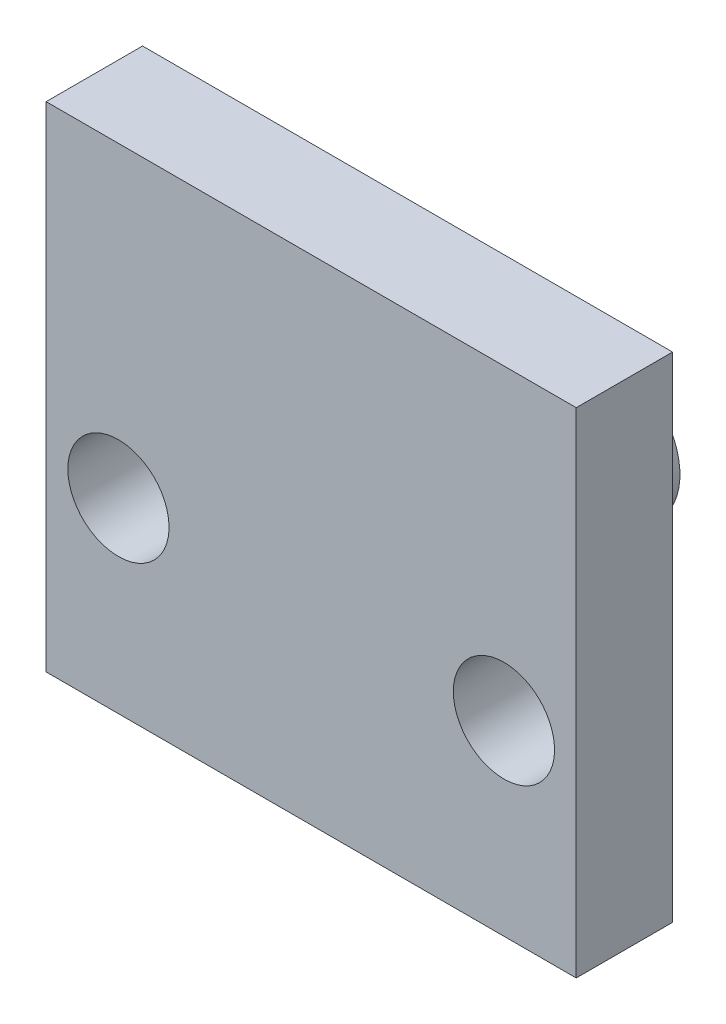
ISO-10303-21;
HEADER;
FILE_DESCRIPTION(('STEP AP214'),'2;1');
FILE_NAME('part.step','',(''),(''),'','','');
FILE_SCHEMA(('AUTOMOTIVE_DESIGN { 1 0 10303 214 1 1 1 1 }'));
ENDSEC;
DATA;
#1=APPLICATION_CONTEXT('core data for automotive mechanical design processes');
#2=APPLICATION_PROTOCOL_DEFINITION('international standard','automotive_design',2000,#1);
#3=PRODUCT_CONTEXT('',#1,'mechanical');
#4=PRODUCT('Part','Part','',(#3));
#5=PRODUCT_RELATED_PRODUCT_CATEGORY('part','',(#4));
#6=PRODUCT_DEFINITION_FORMATION('','',#4);
#7=PRODUCT_DEFINITION_CONTEXT('part definition',#1,'design');
#8=PRODUCT_DEFINITION('design','',#6,#7);
#9=PRODUCT_DEFINITION_SHAPE('','',#8);
#10=(LENGTH_UNIT() NAMED_UNIT(*) SI_UNIT(.MILLI.,.METRE.));
#11=(NAMED_UNIT(*) PLANE_ANGLE_UNIT() SI_UNIT($,.RADIAN.));
#12=(NAMED_UNIT(*) SI_UNIT($,.STERADIAN.) SOLID_ANGLE_UNIT());
#13=UNCERTAINTY_MEASURE_WITH_UNIT(LENGTH_MEASURE(1.E-05),#10,'distance_accuracy_value','');
#14=(GEOMETRIC_REPRESENTATION_CONTEXT(3) GLOBAL_UNCERTAINTY_ASSIGNED_CONTEXT((#13)) GLOBAL_UNIT_ASSIGNED_CONTEXT((#10,
#11,#12)) REPRESENTATION_CONTEXT('',''));
#15=CARTESIAN_POINT('',(0.,0.,0.));
#16=DIRECTION('',(0.,0.,1.));
#17=DIRECTION('',(1.,0.,0.));
#18=AXIS2_PLACEMENT_3D('',#15,#16,#17);
#19=CARTESIAN_POINT('',(10.,0.,6.5));
#20=DIRECTION('',(0.,0.,1.));
#21=DIRECTION('',(1.,0.,0.));
#22=AXIS2_PLACEMENT_3D('',#19,#20,#21);
#23=CYLINDRICAL_SURFACE('',#22,3.6);
#24=CARTESIAN_POINT('',(10.,0.,7.));
#25=DIRECTION('',(0.,0.,-1.));
#26=DIRECTION('',(-1.,0.,0.));
#27=AXIS2_PLACEMENT_3D('',#24,#25,#26);
#28=CIRCLE('',#27,3.6);
#29=CARTESIAN_POINT('',(6.4,0.,7.));
#30=VERTEX_POINT('',#29);
#31=EDGE_CURVE('E232',#30,#30,#28,.T.);
#32=ORIENTED_EDGE('',*,*,#31,.T.);
#33=EDGE_LOOP('',(#32));
#34=FACE_BOUND('',#33,.T.);
#35=CARTESIAN_POINT('',(10.,0.,6.5));
#36=DIRECTION('',(0.,0.,-1.));
#37=DIRECTION('',(-1.,0.,0.));
#38=AXIS2_PLACEMENT_3D('',#35,#36,#37);
#39=CIRCLE('',#38,3.6);
#40=CARTESIAN_POINT('',(6.4,0.,6.5));
#41=VERTEX_POINT('',#40);
#42=EDGE_CURVE('E228',#41,#41,#39,.T.);
#43=ORIENTED_EDGE('',*,*,#42,.F.);
#44=EDGE_LOOP('',(#43));
#45=FACE_BOUND('',#44,.T.);
#46=ADVANCED_FACE('F59',(#34,#45),#23,.T.);
#47=CARTESIAN_POINT('',(10.,0.,6.5));
#48=DIRECTION('',(0.,0.,-1.));
#49=DIRECTION('',(-1.,0.,0.));
#50=AXIS2_PLACEMENT_3D('',#47,#48,#49);
#51=PLANE('',#50);
#52=CARTESIAN_POINT('',(10.,0.,6.5));
#53=DIRECTION('',(0.,0.,-1.));
#54=DIRECTION('',(-1.,0.,0.));
#55=AXIS2_PLACEMENT_3D('',#52,#53,#54);
#56=CIRCLE('',#55,3.0059955650555);
#57=CARTESIAN_POINT('',(10.05,-3.00557970067894,6.5));
#58=VERTEX_POINT('',#57);
#59=CARTESIAN_POINT('',(10.05,3.00557970067894,6.5));
#60=VERTEX_POINT('',#59);
#61=EDGE_CURVE('E243',#58,#60,#56,.F.);
#62=ORIENTED_EDGE('',*,*,#61,.T.);
#63=DIRECTION('',(0.,1.,0.));
#64=VECTOR('',#63,1.);
#65=CARTESIAN_POINT('',(10.05,0.,6.5));
#66=LINE('',#65,#64);
#67=EDGE_CURVE('E255',#60,#58,#66,.F.);
#68=ORIENTED_EDGE('',*,*,#67,.T.);
#69=EDGE_LOOP('',(#62,#68));
#70=FACE_BOUND('',#69,.T.);
#71=CARTESIAN_POINT('',(10.,0.,6.5));
#72=DIRECTION('',(0.,0.,-1.));
#73=DIRECTION('',(-1.,0.,0.));
#74=AXIS2_PLACEMENT_3D('',#71,#72,#73);
#75=CIRCLE('',#74,3.0059955650555);
#76=CARTESIAN_POINT('',(9.95,3.00557970067894,6.5));
#77=VERTEX_POINT('',#76);
#78=CARTESIAN_POINT('',(9.95,-3.00557970067894,6.5));
#79=VERTEX_POINT('',#78);
#80=EDGE_CURVE('E246',#77,#79,#75,.F.);
#81=ORIENTED_EDGE('',*,*,#80,.T.);
#82=DIRECTION('',(0.,-1.,0.));
#83=VECTOR('',#82,1.);
#84=CARTESIAN_POINT('',(9.95,0.,6.5));
#85=LINE('',#84,#83);
#86=EDGE_CURVE('E259',#79,#77,#85,.F.);
#87=ORIENTED_EDGE('',*,*,#86,.T.);
#88=EDGE_LOOP('',(#81,#87));
#89=FACE_BOUND('',#88,.T.);
#90=ORIENTED_EDGE('',*,*,#42,.T.);
#91=EDGE_LOOP('',(#90));
#92=FACE_BOUND('',#91,.T.);
#93=ADVANCED_FACE('F325',(#70,#89,#92),#51,.T.);
#94=CARTESIAN_POINT('',(9.15,0.102420684711406,0.499999999999999));
#95=DIRECTION('',(-1.,0.,0.));
#96=DIRECTION('',(0.,0.,1.));
#97=AXIS2_PLACEMENT_3D('',#94,#95,#96);
#98=PLANE('',#97);
#99=DIRECTION('',(0.,0.,1.));
#100=VECTOR('',#99,1.);
#101=CARTESIAN_POINT('',(9.15,2.67415614935088,0.499999999999999));
#102=LINE('',#101,#100);
#103=CARTESIAN_POINT('',(9.15,2.67415614935088,0.499999999999999));
#104=VERTEX_POINT('',#103);
#105=CARTESIAN_POINT('',(9.15,2.67415614935088,5.7));
#106=VERTEX_POINT('',#105);
#107=EDGE_CURVE('E220',#104,#106,#102,.T.);
#108=ORIENTED_EDGE('',*,*,#107,.T.);
#109=DIRECTION('',(0.,-1.,0.));
#110=VECTOR('',#109,1.);
#111=CARTESIAN_POINT('',(9.15,0.102420684711406,5.7));
#112=LINE('',#111,#110);
#113=CARTESIAN_POINT('',(9.15,-2.67415614935088,5.7));
#114=VERTEX_POINT('',#113);
#115=EDGE_CURVE('E251',#106,#114,#112,.T.);
#116=ORIENTED_EDGE('',*,*,#115,.T.);
#117=DIRECTION('',(0.,0.,1.));
#118=VECTOR('',#117,1.);
#119=CARTESIAN_POINT('',(9.15,-2.67415614935088,0.499999999999999));
#120=LINE('',#119,#118);
#121=CARTESIAN_POINT('',(9.15,-2.67415614935088,0.499999999999999));
#122=VERTEX_POINT('',#121);
#123=EDGE_CURVE('E224',#122,#114,#120,.T.);
#124=ORIENTED_EDGE('',*,*,#123,.F.);
#125=DIRECTION('',(0.,-1.,0.));
#126=VECTOR('',#125,1.);
#127=CARTESIAN_POINT('',(9.15,0.102420684711406,0.499999999999999));
#128=LINE('',#127,#126);
#129=EDGE_CURVE('E214',#104,#122,#128,.T.);
#130=ORIENTED_EDGE('',*,*,#129,.F.);
#131=EDGE_LOOP('',(#108,#116,#124,#130));
#132=FACE_BOUND('',#131,.T.);
#133=ADVANCED_FACE('F328',(#132),#98,.F.);
#134=CARTESIAN_POINT('',(10.,0.,0.499999999999999));
#135=DIRECTION('',(0.,0.,1.));
#136=DIRECTION('',(1.,0.,0.));
#137=AXIS2_PLACEMENT_3D('',#134,#135,#136);
#138=CYLINDRICAL_SURFACE('',#137,2.8059955650555);
#139=ORIENTED_EDGE('',*,*,#123,.T.);
#140=CARTESIAN_POINT('',(9.15,-2.67415614935088,5.7));
#141=CARTESIAN_POINT('',(9.1499560589381,-2.67411148455039,5.74387331577411));
#142=CARTESIAN_POINT('',(9.15360571397061,-2.6753021472176,5.78771326117402));
#143=CARTESIAN_POINT('',(9.16794621720008,-2.67981282150213,5.87401521326183));
#144=CARTESIAN_POINT('',(9.17862088750437,-2.68312794025504,5.91648015126818));
#145=CARTESIAN_POINT('',(9.20666608293818,-2.69154844822738,5.99892690725357));
#146=CARTESIAN_POINT('',(9.22403556001274,-2.6966535572171,6.0389091127611));
#147=CARTESIAN_POINT('',(9.26492832234455,-2.70808642684357,6.11539657863668));
#148=CARTESIAN_POINT('',(9.28845015348211,-2.7144138984805,6.15190265781594));
#149=CARTESIAN_POINT('',(9.33052619368213,-2.72501027614287,6.20688379684342));
#150=CARTESIAN_POINT('',(9.34733557071585,-2.72909706176666,6.22675570390201));
#151=CARTESIAN_POINT('',(9.38276597452721,-2.7373279452152,6.26472842766861));
#152=CARTESIAN_POINT('',(9.40138353965493,-2.74147192099064,6.28283250047709));
#153=CARTESIAN_POINT('',(9.42084973778708,-2.7455775503325,6.3));
#154=B_SPLINE_CURVE_WITH_KNOTS('',3,(#140,#141,#142,#143,#144,#145,#146,#147,#148,#149,#150,
#151,#152,#153),.UNSPECIFIED.,.F.,.F.,(4,2,2,2,2,2,4),(0.,0.131401334262335,0.262501118631041,
0.393580387992193,0.524628704488878,0.603557979405827,0.682339021482702),.UNSPECIFIED.);
#155=CARTESIAN_POINT('',(9.42084973778708,-2.7455775503325,6.3));
#156=VERTEX_POINT('',#155);
#157=EDGE_CURVE('E267',#114,#156,#154,.T.);
#158=ORIENTED_EDGE('',*,*,#157,.T.);
#159=CARTESIAN_POINT('',(10.,0.,6.3));
#160=DIRECTION('',(0.,0.,-1.));
#161=DIRECTION('',(-1.,0.,0.));
#162=AXIS2_PLACEMENT_3D('',#159,#160,#161);
#163=CIRCLE('',#162,2.8059955650555);
#164=CARTESIAN_POINT('',(9.42084973778708,2.7455775503325,6.3));
#165=VERTEX_POINT('',#164);
#166=EDGE_CURVE('E240',#156,#165,#163,.T.);
#167=ORIENTED_EDGE('',*,*,#166,.T.);
#168=CARTESIAN_POINT('',(9.42084973778708,2.7455775503325,6.3));
#169=CARTESIAN_POINT('',(9.38717321451308,2.73847439328553,6.27033698020706));
#170=CARTESIAN_POINT('',(9.35603877734445,2.73125778090853,6.23780922067581));
#171=CARTESIAN_POINT('',(9.29953899781763,2.71731756800495,6.1678812324298));
#172=CARTESIAN_POINT('',(9.27418487289174,2.71059494296334,6.13047174752688));
#173=CARTESIAN_POINT('',(9.23003195997069,2.69838621525648,6.05169790550087));
#174=CARTESIAN_POINT('',(9.21124334063732,2.69290203530228,6.01032753888905));
#175=CARTESIAN_POINT('',(9.18092802770838,2.68383782451641,5.92488536475423));
#176=CARTESIAN_POINT('',(9.16938418199532,2.6802532993784,5.88082021096199));
#177=CARTESIAN_POINT('',(9.15778186829497,2.6766199501454,5.81362955055125));
#178=CARTESIAN_POINT('',(9.15486660570398,2.67569933193839,5.79100991392892));
#179=CARTESIAN_POINT('',(9.15097581278878,2.67446650990298,5.7455975737962));
#180=CARTESIAN_POINT('',(9.14999947645132,2.67415405326237,5.7228049461554));
#181=CARTESIAN_POINT('',(9.15,2.67415614935088,5.7));
#182=B_SPLINE_CURVE_WITH_KNOTS('',3,(#168,#169,#170,#171,#172,#173,#174,#175,#176,#177,#178,
#179,#180,#181),.UNSPECIFIED.,.F.,.F.,(4,2,2,2,2,2,4),(0.,0.136164467235625,0.272590971351782,
0.409227846085663,0.54553999824888,0.613936164533051,0.682303892517546),.UNSPECIFIED.);
#183=EDGE_CURVE('E306',#165,#106,#182,.T.);
#184=ORIENTED_EDGE('',*,*,#183,.T.);
#185=ORIENTED_EDGE('',*,*,#107,.F.);
#186=CARTESIAN_POINT('',(10.,0.,0.499999999999999));
#187=DIRECTION('',(0.,0.,-1.));
#188=DIRECTION('',(-1.,0.,0.));
#189=AXIS2_PLACEMENT_3D('',#186,#187,#188);
#190=CIRCLE('',#189,2.8059955650555);
#191=EDGE_CURVE('E217',#122,#104,#190,.T.);
#192=ORIENTED_EDGE('',*,*,#191,.F.);
#193=EDGE_LOOP('',(#139,#158,#167,#184,#185,#192));
#194=FACE_BOUND('',#193,.T.);
#195=ADVANCED_FACE('F283',(#194),#138,.T.);
#196=CARTESIAN_POINT('',(10.,0.,0.499999999999999));
#197=DIRECTION('',(0.,0.,-1.));
#198=DIRECTION('',(-1.,0.,0.));
#199=AXIS2_PLACEMENT_3D('',#196,#197,#198);
#200=PLANE('',#199);
#201=ORIENTED_EDGE('',*,*,#129,.T.);
#202=ORIENTED_EDGE('',*,*,#191,.T.);
#203=EDGE_LOOP('',(#201,#202));
#204=FACE_BOUND('',#203,.T.);
#205=ADVANCED_FACE('F335',(#204),#200,.T.);
#206=CARTESIAN_POINT('',(10.85,0.,0.499999999999999));
#207=DIRECTION('',(1.,0.,0.));
#208=DIRECTION('',(0.,0.,-1.));
#209=AXIS2_PLACEMENT_3D('',#206,#207,#208);
#210=PLANE('',#209);
#211=DIRECTION('',(0.,0.,1.));
#212=VECTOR('',#211,1.);
#213=CARTESIAN_POINT('',(10.85,-2.67415614935088,0.499999999999999));
#214=LINE('',#213,#212);
#215=CARTESIAN_POINT('',(10.85,-2.67415614935088,0.499999999999999));
#216=VERTEX_POINT('',#215);
#217=CARTESIAN_POINT('',(10.85,-2.67415614935088,5.7));
#218=VERTEX_POINT('',#217);
#219=EDGE_CURVE('E204',#216,#218,#214,.T.);
#220=ORIENTED_EDGE('',*,*,#219,.T.);
#221=DIRECTION('',(0.,1.,0.));
#222=VECTOR('',#221,1.);
#223=CARTESIAN_POINT('',(10.85,0.,5.7));
#224=LINE('',#223,#222);
#225=CARTESIAN_POINT('',(10.85,2.67415614935088,5.7));
#226=VERTEX_POINT('',#225);
#227=EDGE_CURVE('E263',#218,#226,#224,.T.);
#228=ORIENTED_EDGE('',*,*,#227,.T.);
#229=DIRECTION('',(0.,0.,1.));
#230=VECTOR('',#229,1.);
#231=CARTESIAN_POINT('',(10.85,2.67415614935088,0.499999999999999));
#232=LINE('',#231,#230);
#233=CARTESIAN_POINT('',(10.85,2.67415614935088,0.499999999999999));
#234=VERTEX_POINT('',#233);
#235=EDGE_CURVE('E200',#234,#226,#232,.T.);
#236=ORIENTED_EDGE('',*,*,#235,.F.);
#237=DIRECTION('',(0.,1.,0.));
#238=VECTOR('',#237,1.);
#239=CARTESIAN_POINT('',(10.85,0.,0.499999999999999));
#240=LINE('',#239,#238);
#241=EDGE_CURVE('E211',#216,#234,#240,.T.);
#242=ORIENTED_EDGE('',*,*,#241,.F.);
#243=EDGE_LOOP('',(#220,#228,#236,#242));
#244=FACE_BOUND('',#243,.T.);
#245=ADVANCED_FACE('F349',(#244),#210,.F.);
#246=CARTESIAN_POINT('',(10.,0.,0.499999999999999));
#247=DIRECTION('',(0.,0.,1.));
#248=DIRECTION('',(1.,0.,0.));
#249=AXIS2_PLACEMENT_3D('',#246,#247,#248);
#250=CYLINDRICAL_SURFACE('',#249,2.8059955650555);
#251=ORIENTED_EDGE('',*,*,#235,.T.);
#252=CARTESIAN_POINT('',(10.85,2.67415614935088,5.7));
#253=CARTESIAN_POINT('',(10.8500439410619,2.67411148455038,5.74387331577411));
#254=CARTESIAN_POINT('',(10.8463942860294,2.6753021472176,5.78771326117402));
#255=CARTESIAN_POINT('',(10.8320537827999,2.67981282150213,5.87401521326183));
#256=CARTESIAN_POINT('',(10.8213791124956,2.68312794025504,5.91648015126818));
#257=CARTESIAN_POINT('',(10.7933339170618,2.69154844822738,5.99892690725357));
#258=CARTESIAN_POINT('',(10.7759644399873,2.6966535572171,6.0389091127611));
#259=CARTESIAN_POINT('',(10.7350716776555,2.70808642684357,6.11539657863668));
#260=CARTESIAN_POINT('',(10.7115498465179,2.7144138984805,6.15190265781594));
#261=CARTESIAN_POINT('',(10.6694738063179,2.72501027614287,6.20688379684342));
#262=CARTESIAN_POINT('',(10.6526644292842,2.72909706176666,6.22675570390201));
#263=CARTESIAN_POINT('',(10.6172340254728,2.7373279452152,6.26472842766861));
#264=CARTESIAN_POINT('',(10.5986164603451,2.74147192099064,6.28283250047709));
#265=CARTESIAN_POINT('',(10.5791502622129,2.7455775503325,6.3));
#266=B_SPLINE_CURVE_WITH_KNOTS('',3,(#252,#253,#254,#255,#256,#257,#258,#259,#260,#261,#262,
#263,#264,#265),.UNSPECIFIED.,.F.,.F.,(4,2,2,2,2,2,4),(0.,0.131401334262335,0.262501118631041,
0.393580387992193,0.524628704488878,0.603557979405827,0.682339021482702),.UNSPECIFIED.);
#267=CARTESIAN_POINT('',(10.5791502622129,2.7455775503325,6.3));
#268=VERTEX_POINT('',#267);
#269=EDGE_CURVE('E365',#226,#268,#266,.T.);
#270=ORIENTED_EDGE('',*,*,#269,.T.);
#271=CARTESIAN_POINT('',(10.,0.,6.3));
#272=DIRECTION('',(0.,0.,-1.));
#273=DIRECTION('',(-1.,0.,0.));
#274=AXIS2_PLACEMENT_3D('',#271,#272,#273);
#275=CIRCLE('',#274,2.8059955650555);
#276=CARTESIAN_POINT('',(10.5791502622129,-2.7455775503325,6.3));
#277=VERTEX_POINT('',#276);
#278=EDGE_CURVE('E88',#268,#277,#275,.T.);
#279=ORIENTED_EDGE('',*,*,#278,.T.);
#280=CARTESIAN_POINT('',(10.5791502622129,-2.7455775503325,6.3));
#281=CARTESIAN_POINT('',(10.6128267854869,-2.73847439328553,6.27033698020706));
#282=CARTESIAN_POINT('',(10.6439612226555,-2.73125778090852,6.23780922067581));
#283=CARTESIAN_POINT('',(10.7004610021824,-2.71731756800495,6.1678812324298));
#284=CARTESIAN_POINT('',(10.7258151271083,-2.71059494296334,6.13047174752688));
#285=CARTESIAN_POINT('',(10.7699680400293,-2.69838621525648,6.05169790550087));
#286=CARTESIAN_POINT('',(10.7887566593627,-2.69290203530228,6.01032753888905));
#287=CARTESIAN_POINT('',(10.8190719722916,-2.68383782451641,5.92488536475423));
#288=CARTESIAN_POINT('',(10.8306158180047,-2.6802532993784,5.88082021096198));
#289=CARTESIAN_POINT('',(10.842218131705,-2.67661995014539,5.81362955055125));
#290=CARTESIAN_POINT('',(10.845133394296,-2.67569933193839,5.79100991392892));
#291=CARTESIAN_POINT('',(10.8490241872112,-2.67446650990298,5.7455975737962));
#292=CARTESIAN_POINT('',(10.8500005235487,-2.67415405326237,5.7228049461554));
#293=CARTESIAN_POINT('',(10.85,-2.67415614935088,5.7));
#294=B_SPLINE_CURVE_WITH_KNOTS('',3,(#280,#281,#282,#283,#284,#285,#286,#287,#288,#289,#290,
#291,#292,#293),.UNSPECIFIED.,.F.,.F.,(4,2,2,2,2,2,4),(0.,0.136164467235624,0.272590971351781,
0.409227846085663,0.54553999824888,0.61393616453305,0.682303892517546),.UNSPECIFIED.);
#295=EDGE_CURVE('E11',#277,#218,#294,.T.);
#296=ORIENTED_EDGE('',*,*,#295,.T.);
#297=ORIENTED_EDGE('',*,*,#219,.F.);
#298=CARTESIAN_POINT('',(10.,0.,0.499999999999999));
#299=DIRECTION('',(0.,0.,-1.));
#300=DIRECTION('',(-1.,0.,0.));
#301=AXIS2_PLACEMENT_3D('',#298,#299,#300);
#302=CIRCLE('',#301,2.8059955650555);
#303=EDGE_CURVE('E208',#234,#216,#302,.T.);
#304=ORIENTED_EDGE('',*,*,#303,.F.);
#305=EDGE_LOOP('',(#251,#270,#279,#296,#297,#304));
#306=FACE_BOUND('',#305,.T.);
#307=ADVANCED_FACE('F354',(#306),#250,.T.);
#308=CARTESIAN_POINT('',(10.,0.,0.499999999999999));
#309=DIRECTION('',(0.,0.,-1.));
#310=DIRECTION('',(-1.,0.,0.));
#311=AXIS2_PLACEMENT_3D('',#308,#309,#310);
#312=PLANE('',#311);
#313=ORIENTED_EDGE('',*,*,#241,.T.);
#314=ORIENTED_EDGE('',*,*,#303,.T.);
#315=EDGE_LOOP('',(#313,#314));
#316=FACE_BOUND('',#315,.T.);
#317=ADVANCED_FACE('F358',(#316),#312,.T.);
#318=CARTESIAN_POINT('',(21.,-12.75,13.));
#319=DIRECTION('',(-1.,0.,0.));
#320=DIRECTION('',(0.,0.,1.));
#321=AXIS2_PLACEMENT_3D('',#318,#319,#320);
#322=PLANE('',#321);
#323=DIRECTION('',(0.,1.,0.));
#324=VECTOR('',#323,1.);
#325=CARTESIAN_POINT('',(21.,-12.75,13.));
#326=LINE('',#325,#324);
#327=CARTESIAN_POINT('',(21.,-7.75,13.));
#328=VERTEX_POINT('',#327);
#329=CARTESIAN_POINT('',(21.,12.75,13.));
#330=VERTEX_POINT('',#329);
#331=EDGE_CURVE('E184',#328,#330,#326,.T.);
#332=ORIENTED_EDGE('',*,*,#331,.F.);
#333=DIRECTION('',(0.,0.,-1.));
#334=VECTOR('',#333,1.);
#335=CARTESIAN_POINT('',(21.,-7.75,13.001));
#336=LINE('',#335,#334);
#337=CARTESIAN_POINT('',(21.,-7.75,9.));
#338=VERTEX_POINT('',#337);
#339=EDGE_CURVE('E155',#328,#338,#336,.T.);
#340=ORIENTED_EDGE('',*,*,#339,.T.);
#341=DIRECTION('',(0.,1.,0.));
#342=VECTOR('',#341,1.);
#343=CARTESIAN_POINT('',(21.,-12.75,9.));
#344=LINE('',#343,#342);
#345=CARTESIAN_POINT('',(21.,12.75,9.));
#346=VERTEX_POINT('',#345);
#347=EDGE_CURVE('E188',#338,#346,#344,.T.);
#348=ORIENTED_EDGE('',*,*,#347,.T.);
#349=DIRECTION('',(0.,0.,-1.));
#350=VECTOR('',#349,1.);
#351=CARTESIAN_POINT('',(21.,12.75,13.));
#352=LINE('',#351,#350);
#353=EDGE_CURVE('E182',#330,#346,#352,.T.);
#354=ORIENTED_EDGE('',*,*,#353,.F.);
#355=EDGE_LOOP('',(#332,#340,#348,#354));
#356=FACE_BOUND('',#355,.T.);
#357=ADVANCED_FACE('F359',(#356),#322,.F.);
#358=CARTESIAN_POINT('',(-0.999999999999999,12.75,13.));
#359=DIRECTION('',(0.,-1.,0.));
#360=DIRECTION('',(0.,0.,-1.));
#361=AXIS2_PLACEMENT_3D('',#358,#359,#360);
#362=PLANE('',#361);
#363=DIRECTION('',(-1.,0.,0.));
#364=VECTOR('',#363,1.);
#365=CARTESIAN_POINT('',(-0.999999999999999,12.75,9.));
#366=LINE('',#365,#364);
#367=CARTESIAN_POINT('',(-0.999999999999999,12.75,9.));
#368=VERTEX_POINT('',#367);
#369=EDGE_CURVE('E191',#346,#368,#366,.T.);
#370=ORIENTED_EDGE('',*,*,#369,.T.);
#371=DIRECTION('',(0.,0.,-1.));
#372=VECTOR('',#371,1.);
#373=CARTESIAN_POINT('',(-0.999999999999999,12.75,13.));
#374=LINE('',#373,#372);
#375=CARTESIAN_POINT('',(-0.999999999999999,12.75,13.));
#376=VERTEX_POINT('',#375);
#377=EDGE_CURVE('E178',#376,#368,#374,.T.);
#378=ORIENTED_EDGE('',*,*,#377,.F.);
#379=DIRECTION('',(-1.,0.,0.));
#380=VECTOR('',#379,1.);
#381=CARTESIAN_POINT('',(-0.999999999999999,12.75,13.));
#382=LINE('',#381,#380);
#383=EDGE_CURVE('E175',#330,#376,#382,.T.);
#384=ORIENTED_EDGE('',*,*,#383,.F.);
#385=ORIENTED_EDGE('',*,*,#353,.T.);
#386=EDGE_LOOP('',(#370,#378,#384,#385));
#387=FACE_BOUND('',#386,.T.);
#388=ADVANCED_FACE('F425',(#387),#362,.F.);
#389=CARTESIAN_POINT('',(-0.999999999999999,-12.75,13.));
#390=DIRECTION('',(1.,0.,0.));
#391=DIRECTION('',(0.,0.,-1.));
#392=AXIS2_PLACEMENT_3D('',#389,#390,#391);
#393=PLANE('',#392);
#394=DIRECTION('',(0.,-1.,0.));
#395=VECTOR('',#394,1.);
#396=CARTESIAN_POINT('',(-0.999999999999999,-12.75,9.));
#397=LINE('',#396,#395);
#398=CARTESIAN_POINT('',(-0.999999999999999,-7.75,9.));
#399=VERTEX_POINT('',#398);
#400=EDGE_CURVE('E169',#368,#399,#397,.T.);
#401=ORIENTED_EDGE('',*,*,#400,.T.);
#402=DIRECTION('',(0.,0.,-1.));
#403=VECTOR('',#402,1.);
#404=CARTESIAN_POINT('',(-0.999999999999999,-7.75,13.001));
#405=LINE('',#404,#403);
#406=CARTESIAN_POINT('',(-0.999999999999999,-7.75,13.));
#407=VERTEX_POINT('',#406);
#408=EDGE_CURVE('E81',#407,#399,#405,.T.);
#409=ORIENTED_EDGE('',*,*,#408,.F.);
#410=DIRECTION('',(0.,-1.,0.));
#411=VECTOR('',#410,1.);
#412=CARTESIAN_POINT('',(-0.999999999999999,-12.75,13.));
#413=LINE('',#412,#411);
#414=EDGE_CURVE('E167',#376,#407,#413,.T.);
#415=ORIENTED_EDGE('',*,*,#414,.F.);
#416=ORIENTED_EDGE('',*,*,#377,.T.);
#417=EDGE_LOOP('',(#401,#409,#415,#416));
#418=FACE_BOUND('',#417,.T.);
#419=ADVANCED_FACE('F165',(#418),#393,.F.);
#420=CARTESIAN_POINT('',(0.,0.,13.));
#421=DIRECTION('',(0.,0.,-1.));
#422=DIRECTION('',(-1.,0.,0.));
#423=AXIS2_PLACEMENT_3D('',#420,#421,#422);
#424=PLANE('',#423);
#425=CARTESIAN_POINT('',(18.,0.,13.));
#426=DIRECTION('',(0.,0.,-1.));
#427=DIRECTION('',(-1.,0.,0.));
#428=AXIS2_PLACEMENT_3D('',#425,#426,#427);
#429=CIRCLE('',#428,2.1);
#430=CARTESIAN_POINT('',(15.9,0.,13.));
#431=VERTEX_POINT('',#430);
#432=EDGE_CURVE('E192',#431,#431,#429,.F.);
#433=ORIENTED_EDGE('',*,*,#432,.F.);
#434=EDGE_LOOP('',(#433));
#435=FACE_BOUND('',#434,.T.);
#436=CARTESIAN_POINT('',(2.,0.,13.));
#437=DIRECTION('',(0.,0.,-1.));
#438=DIRECTION('',(-1.,0.,0.));
#439=AXIS2_PLACEMENT_3D('',#436,#437,#438);
#440=CIRCLE('',#439,2.1);
#441=CARTESIAN_POINT('',(-0.0999999999999994,0.,13.));
#442=VERTEX_POINT('',#441);
#443=EDGE_CURVE('E160',#442,#442,#440,.F.);
#444=ORIENTED_EDGE('',*,*,#443,.F.);
#445=EDGE_LOOP('',(#444));
#446=FACE_BOUND('',#445,.T.);
#447=ORIENTED_EDGE('',*,*,#414,.T.);
#448=DIRECTION('',(-1.,0.,0.));
#449=VECTOR('',#448,1.);
#450=CARTESIAN_POINT('',(-0.999999999999999,-7.75,13.));
#451=LINE('',#450,#449);
#452=EDGE_CURVE('E152',#328,#407,#451,.T.);
#453=ORIENTED_EDGE('',*,*,#452,.F.);
#454=ORIENTED_EDGE('',*,*,#331,.T.);
#455=ORIENTED_EDGE('',*,*,#383,.T.);
#456=EDGE_LOOP('',(#447,#453,#454,#455));
#457=FACE_BOUND('',#456,.T.);
#458=ADVANCED_FACE('F173',(#435,#446,#457),#424,.F.);
#459=CARTESIAN_POINT('',(0.,0.,9.));
#460=DIRECTION('',(0.,0.,-1.));
#461=DIRECTION('',(-1.,0.,0.));
#462=AXIS2_PLACEMENT_3D('',#459,#460,#461);
#463=PLANE('',#462);
#464=DIRECTION('',(1.,0.,0.));
#465=VECTOR('',#464,1.);
#466=CARTESIAN_POINT('',(-0.999999999999999,-7.75,9.));
#467=LINE('',#466,#465);
#468=EDGE_CURVE('E171',#399,#338,#467,.T.);
#469=ORIENTED_EDGE('',*,*,#468,.F.);
#470=ORIENTED_EDGE('',*,*,#400,.F.);
#471=ORIENTED_EDGE('',*,*,#369,.F.);
#472=ORIENTED_EDGE('',*,*,#347,.F.);
#473=EDGE_LOOP('',(#469,#470,#471,#472));
#474=FACE_BOUND('',#473,.T.);
#475=CARTESIAN_POINT('',(18.,0.,9.));
#476=DIRECTION('',(0.,0.,-1.));
#477=DIRECTION('',(-1.,0.,0.));
#478=AXIS2_PLACEMENT_3D('',#475,#476,#477);
#479=CIRCLE('',#478,2.1);
#480=CARTESIAN_POINT('',(15.9,0.,9.));
#481=VERTEX_POINT('',#480);
#482=EDGE_CURVE('E439',#481,#481,#479,.T.);
#483=ORIENTED_EDGE('',*,*,#482,.F.);
#484=EDGE_LOOP('',(#483));
#485=FACE_BOUND('',#484,.T.);
#486=CARTESIAN_POINT('',(2.,0.,9.));
#487=DIRECTION('',(0.,0.,-1.));
#488=DIRECTION('',(-1.,0.,0.));
#489=AXIS2_PLACEMENT_3D('',#486,#487,#488);
#490=CIRCLE('',#489,2.1);
#491=CARTESIAN_POINT('',(-0.0999999999999994,0.,9.));
#492=VERTEX_POINT('',#491);
#493=EDGE_CURVE('E435',#492,#492,#490,.T.);
#494=ORIENTED_EDGE('',*,*,#493,.F.);
#495=EDGE_LOOP('',(#494));
#496=FACE_BOUND('',#495,.T.);
#497=CARTESIAN_POINT('',(10.,0.,9.));
#498=DIRECTION('',(0.,0.,-1.));
#499=DIRECTION('',(-1.,0.,0.));
#500=AXIS2_PLACEMENT_3D('',#497,#498,#499);
#501=CIRCLE('',#500,5.6);
#502=CARTESIAN_POINT('',(4.4,0.,9.));
#503=VERTEX_POINT('',#502);
#504=EDGE_CURVE('E236',#503,#503,#501,.F.);
#505=ORIENTED_EDGE('',*,*,#504,.T.);
#506=EDGE_LOOP('',(#505));
#507=FACE_BOUND('',#506,.T.);
#508=ADVANCED_FACE('F321',(#474,#485,#496,#507),#463,.T.);
#509=CARTESIAN_POINT('',(10.,0.,7.));
#510=DIRECTION('',(0.,0.,-1.));
#511=DIRECTION('',(-1.,0.,0.));
#512=AXIS2_PLACEMENT_3D('',#509,#510,#511);
#513=TOROIDAL_SURFACE('',#512,5.6,2.);
#514=ORIENTED_EDGE('',*,*,#504,.F.);
#515=EDGE_LOOP('',(#514));
#516=FACE_BOUND('',#515,.T.);
#517=ORIENTED_EDGE('',*,*,#31,.F.);
#518=EDGE_LOOP('',(#517));
#519=FACE_BOUND('',#518,.T.);
#520=ADVANCED_FACE('F316',(#516,#519),#513,.F.);
#521=CARTESIAN_POINT('',(10.,0.,6.3));
#522=DIRECTION('',(0.,0.,-1.));
#523=DIRECTION('',(-1.,0.,0.));
#524=AXIS2_PLACEMENT_3D('',#521,#522,#523);
#525=TOROIDAL_SURFACE('',#524,3.0059955650555,0.2);
#526=ORIENTED_EDGE('',*,*,#166,.F.);
#527=CARTESIAN_POINT('',(9.42084973778708,-2.7455775503325,6.3));
#528=CARTESIAN_POINT('',(9.4313372043447,-2.7478002505776,6.30924932042326));
#529=CARTESIAN_POINT('',(9.44197801257535,-2.75062577723746,6.3181446767989));
#530=CARTESIAN_POINT('',(9.4634949458456,-2.75724108576196,6.33521718866143));
#531=CARTESIAN_POINT('',(9.47437048619915,-2.76102867907752,6.34339591830951));
#532=CARTESIAN_POINT('',(9.50718243071783,-2.77344393336381,6.36680752346019));
#533=CARTESIAN_POINT('',(9.52943125864161,-2.78315644198941,6.3810266123171));
#534=CARTESIAN_POINT('',(9.57173035070357,-2.80302027767799,6.4052877582492));
#535=CARTESIAN_POINT('',(9.59171079577809,-2.8129675575641,6.41562920159894));
#536=CARTESIAN_POINT('',(9.63208884664545,-2.83374474168949,6.43445806355012));
#537=CARTESIAN_POINT('',(9.65248668512914,-2.84457514888809,6.44294441536868));
#538=CARTESIAN_POINT('',(9.71438088970548,-2.87793489090837,6.4657833680452));
#539=CARTESIAN_POINT('',(9.75646507513176,-2.90127564526593,6.47745232109761));
#540=CARTESIAN_POINT('',(9.8216546322905,-2.93707004814138,6.48997043585745));
#541=CARTESIAN_POINT('',(9.84435735041607,-2.94947053773718,6.49332701886852));
#542=CARTESIAN_POINT('',(9.89001800207477,-2.97409092124928,6.49807754287177));
#543=CARTESIAN_POINT('',(9.91297528319023,-2.98631114567793,6.49947568118699));
#544=CARTESIAN_POINT('',(9.93901680560281,-2.99988598715864,6.49993013875709));
#545=CARTESIAN_POINT('',(9.94199522916158,-3.0014343544161,6.49996550248194));
#546=CARTESIAN_POINT('',(9.94664976302262,-3.00384719043832,6.49999473726733));
#547=CARTESIAN_POINT('',(9.94832457176175,-3.00471399603146,6.50000000038418));
#548=CARTESIAN_POINT('',(9.95,-3.00557970067894,6.5));
#549=B_SPLINE_CURVE_WITH_KNOTS('',3,(#527,#528,#529,#530,#531,#532,#533,#534,#535,#536,#537,
#538,#539,#540,#541,#542,#543,#544,#545,#546,#547,#548),.UNSPECIFIED.,.F.,.F.,(4,2,2,2,2,2,2,2,
2,2,4),(0.,0.0424241480984694,0.0847526390471822,0.168900121382221,0.242604626263325,
0.31635140456429,0.464265071042284,0.542470787552449,0.620508636404711,0.630579783181364,
0.636237286851934),.UNSPECIFIED.);
#550=EDGE_CURVE('E276',#156,#79,#549,.T.);
#551=ORIENTED_EDGE('',*,*,#550,.T.);
#552=ORIENTED_EDGE('',*,*,#80,.F.);
#553=CARTESIAN_POINT('',(9.42084973778708,2.7455775503325,6.3));
#554=CARTESIAN_POINT('',(9.4313372043447,2.7478002505776,6.30924932042326));
#555=CARTESIAN_POINT('',(9.44197801257535,2.75062577723746,6.3181446767989));
#556=CARTESIAN_POINT('',(9.4634949458456,2.75724108576196,6.33521718866143));
#557=CARTESIAN_POINT('',(9.47437048619915,2.76102867907752,6.34339591830951));
#558=CARTESIAN_POINT('',(9.50718243071783,2.77344393336381,6.36680752346019));
#559=CARTESIAN_POINT('',(9.52943125864161,2.78315644198941,6.3810266123171));
#560=CARTESIAN_POINT('',(9.57173035070357,2.80302027767799,6.4052877582492));
#561=CARTESIAN_POINT('',(9.59171079577809,2.8129675575641,6.41562920159894));
#562=CARTESIAN_POINT('',(9.63208884664545,2.83374474168949,6.43445806355012));
#563=CARTESIAN_POINT('',(9.65248668512914,2.84457514888809,6.44294441536868));
#564=CARTESIAN_POINT('',(9.71438088970548,2.87793489090837,6.4657833680452));
#565=CARTESIAN_POINT('',(9.75646507513176,2.90127564526593,6.47745232109761));
#566=CARTESIAN_POINT('',(9.8216546322905,2.93707004814138,6.48997043585745));
#567=CARTESIAN_POINT('',(9.84435735041607,2.94947053773718,6.49332701886852));
#568=CARTESIAN_POINT('',(9.89001800207477,2.97409092124928,6.49807754287177));
#569=CARTESIAN_POINT('',(9.91297528319023,2.98631114567793,6.49947568118699));
#570=CARTESIAN_POINT('',(9.93901680560281,2.99988598715864,6.49993013875709));
#571=CARTESIAN_POINT('',(9.94199522916158,3.0014343544161,6.49996550248194));
#572=CARTESIAN_POINT('',(9.94664976302262,3.00384719043832,6.49999473726733));
#573=CARTESIAN_POINT('',(9.94832457176175,3.00471399603146,6.50000000038418));
#574=CARTESIAN_POINT('',(9.95,3.00557970067894,6.5));
#575=B_SPLINE_CURVE_WITH_KNOTS('',3,(#553,#554,#555,#556,#557,#558,#559,#560,#561,#562,#563,
#564,#565,#566,#567,#568,#569,#570,#571,#572,#573,#574),.UNSPECIFIED.,.F.,.F.,(4,2,2,2,2,2,2,2,
2,2,4),(0.,0.0424241480984693,0.0847526390471822,0.168900121382221,0.242604626263325,
0.31635140456429,0.464265071042284,0.542470787552449,0.620508636404711,0.630579783181364,
0.636237286851934),.UNSPECIFIED.);
#576=EDGE_CURVE('E299',#77,#165,#575,.F.);
#577=ORIENTED_EDGE('',*,*,#576,.T.);
#578=EDGE_LOOP('',(#526,#551,#552,#577));
#579=FACE_BOUND('',#578,.T.);
#580=ADVANCED_FACE('F312',(#579),#525,.F.);
#581=CARTESIAN_POINT('',(10.,0.,6.3));
#582=DIRECTION('',(0.,0.,-1.));
#583=DIRECTION('',(-1.,0.,0.));
#584=AXIS2_PLACEMENT_3D('',#581,#582,#583);
#585=TOROIDAL_SURFACE('',#584,3.0059955650555,0.2);
#586=ORIENTED_EDGE('',*,*,#278,.F.);
#587=CARTESIAN_POINT('',(10.5791502622129,2.7455775503325,6.3));
#588=CARTESIAN_POINT('',(10.5686627956553,2.7478002505776,6.30924932042326));
#589=CARTESIAN_POINT('',(10.5580219874247,2.75062577723745,6.3181446767989));
#590=CARTESIAN_POINT('',(10.5365050541544,2.75724108576196,6.33521718866143));
#591=CARTESIAN_POINT('',(10.5256295138009,2.76102867907752,6.34339591830951));
#592=CARTESIAN_POINT('',(10.4928175692822,2.77344393336381,6.36680752346019));
#593=CARTESIAN_POINT('',(10.4705687413584,2.78315644198941,6.3810266123171));
#594=CARTESIAN_POINT('',(10.4282696492964,2.80302027767799,6.4052877582492));
#595=CARTESIAN_POINT('',(10.4082892042219,2.8129675575641,6.41562920159894));
#596=CARTESIAN_POINT('',(10.3679111533546,2.83374474168948,6.43445806355012));
#597=CARTESIAN_POINT('',(10.3475133148709,2.84457514888809,6.44294441536868));
#598=CARTESIAN_POINT('',(10.2856191102945,2.87793489090837,6.4657833680452));
#599=CARTESIAN_POINT('',(10.2435349248682,2.90127564526593,6.47745232109761));
#600=CARTESIAN_POINT('',(10.1783453677095,2.93707004814137,6.48997043585745));
#601=CARTESIAN_POINT('',(10.1556426495839,2.94947053773718,6.49332701886852));
#602=CARTESIAN_POINT('',(10.1099819979252,2.97409092124928,6.49807754287177));
#603=CARTESIAN_POINT('',(10.0870247168098,2.98631114567793,6.49947568118699));
#604=CARTESIAN_POINT('',(10.0609831943972,2.99988598715864,6.49993013875709));
#605=CARTESIAN_POINT('',(10.0580047708384,3.0014343544161,6.49996550248194));
#606=CARTESIAN_POINT('',(10.0533502369774,3.00384719043832,6.49999473726733));
#607=CARTESIAN_POINT('',(10.0516754282382,3.00471399603146,6.50000000038418));
#608=CARTESIAN_POINT('',(10.05,3.00557970067894,6.5));
#609=B_SPLINE_CURVE_WITH_KNOTS('',3,(#587,#588,#589,#590,#591,#592,#593,#594,#595,#596,#597,
#598,#599,#600,#601,#602,#603,#604,#605,#606,#607,#608),.UNSPECIFIED.,.F.,.F.,(4,2,2,2,2,2,2,2,
2,2,4),(0.,0.0424241480984695,0.0847526390471823,0.168900121382221,0.242604626263325,
0.31635140456429,0.464265071042284,0.542470787552449,0.620508636404711,0.630579783181364,
0.636237286851934),.UNSPECIFIED.);
#610=EDGE_CURVE('E372',#268,#60,#609,.T.);
#611=ORIENTED_EDGE('',*,*,#610,.T.);
#612=ORIENTED_EDGE('',*,*,#61,.F.);
#613=CARTESIAN_POINT('',(10.5791502622129,-2.7455775503325,6.3));
#614=CARTESIAN_POINT('',(10.5686627956553,-2.7478002505776,6.30924932042326));
#615=CARTESIAN_POINT('',(10.5580219874247,-2.75062577723745,6.3181446767989));
#616=CARTESIAN_POINT('',(10.5365050541544,-2.75724108576196,6.33521718866143));
#617=CARTESIAN_POINT('',(10.5256295138009,-2.76102867907752,6.34339591830951));
#618=CARTESIAN_POINT('',(10.4928175692822,-2.77344393336381,6.36680752346019));
#619=CARTESIAN_POINT('',(10.4705687413584,-2.78315644198941,6.3810266123171));
#620=CARTESIAN_POINT('',(10.4282696492964,-2.80302027767799,6.4052877582492));
#621=CARTESIAN_POINT('',(10.4082892042219,-2.8129675575641,6.41562920159894));
#622=CARTESIAN_POINT('',(10.3679111533546,-2.83374474168948,6.43445806355012));
#623=CARTESIAN_POINT('',(10.3475133148709,-2.84457514888809,6.44294441536868));
#624=CARTESIAN_POINT('',(10.2856191102945,-2.87793489090837,6.4657833680452));
#625=CARTESIAN_POINT('',(10.2435349248682,-2.90127564526593,6.47745232109761));
#626=CARTESIAN_POINT('',(10.1783453677095,-2.93707004814137,6.48997043585745));
#627=CARTESIAN_POINT('',(10.1556426495839,-2.94947053773718,6.49332701886852));
#628=CARTESIAN_POINT('',(10.1099819979252,-2.97409092124928,6.49807754287177));
#629=CARTESIAN_POINT('',(10.0870247168098,-2.98631114567793,6.49947568118699));
#630=CARTESIAN_POINT('',(10.0609831943972,-2.99988598715864,6.49993013875709));
#631=CARTESIAN_POINT('',(10.0580047708384,-3.0014343544161,6.49996550248194));
#632=CARTESIAN_POINT('',(10.0533502369774,-3.00384719043832,6.49999473726733));
#633=CARTESIAN_POINT('',(10.0516754282382,-3.00471399603146,6.50000000038418));
#634=CARTESIAN_POINT('',(10.05,-3.00557970067894,6.5));
#635=B_SPLINE_CURVE_WITH_KNOTS('',3,(#613,#614,#615,#616,#617,#618,#619,#620,#621,#622,#623,
#624,#625,#626,#627,#628,#629,#630,#631,#632,#633,#634),.UNSPECIFIED.,.F.,.F.,(4,2,2,2,2,2,2,2,
2,2,4),(0.,0.0424241480984695,0.0847526390471823,0.168900121382221,0.242604626263325,
0.31635140456429,0.464265071042284,0.542470787552449,0.620508636404711,0.630579783181364,
0.636237286851934),.UNSPECIFIED.);
#636=EDGE_CURVE('E74',#58,#277,#635,.F.);
#637=ORIENTED_EDGE('',*,*,#636,.T.);
#638=EDGE_LOOP('',(#586,#611,#612,#637));
#639=FACE_BOUND('',#638,.T.);
#640=ADVANCED_FACE('F293',(#639),#585,.F.);
#641=CARTESIAN_POINT('',(2.,0.,13.001));
#642=DIRECTION('',(0.,0.,-1.));
#643=DIRECTION('',(-1.,0.,0.));
#644=AXIS2_PLACEMENT_3D('',#641,#642,#643);
#645=CYLINDRICAL_SURFACE('',#644,2.1);
#646=ORIENTED_EDGE('',*,*,#493,.T.);
#647=EDGE_LOOP('',(#646));
#648=FACE_BOUND('',#647,.T.);
#649=ORIENTED_EDGE('',*,*,#443,.T.);
#650=EDGE_LOOP('',(#649));
#651=FACE_BOUND('',#650,.T.);
#652=ADVANCED_FACE('F413',(#648,#651),#645,.F.);
#653=CARTESIAN_POINT('',(18.,0.,13.001));
#654=DIRECTION('',(0.,0.,-1.));
#655=DIRECTION('',(-1.,0.,0.));
#656=AXIS2_PLACEMENT_3D('',#653,#654,#655);
#657=CYLINDRICAL_SURFACE('',#656,2.1);
#658=ORIENTED_EDGE('',*,*,#482,.T.);
#659=EDGE_LOOP('',(#658));
#660=FACE_BOUND('',#659,.T.);
#661=ORIENTED_EDGE('',*,*,#432,.T.);
#662=EDGE_LOOP('',(#661));
#663=FACE_BOUND('',#662,.T.);
#664=ADVANCED_FACE('F291',(#660,#663),#657,.F.);
#665=CARTESIAN_POINT('',(9.95,0.102420684711406,5.7));
#666=DIRECTION('',(0.,-1.,0.));
#667=DIRECTION('',(0.,0.,-1.));
#668=AXIS2_PLACEMENT_3D('',#665,#666,#667);
#669=CYLINDRICAL_SURFACE('',#668,0.8);
#670=ORIENTED_EDGE('',*,*,#576,.F.);
#671=ORIENTED_EDGE('',*,*,#86,.F.);
#672=ORIENTED_EDGE('',*,*,#550,.F.);
#673=ORIENTED_EDGE('',*,*,#157,.F.);
#674=ORIENTED_EDGE('',*,*,#115,.F.);
#675=ORIENTED_EDGE('',*,*,#183,.F.);
#676=EDGE_LOOP('',(#670,#671,#672,#673,#674,#675));
#677=FACE_BOUND('',#676,.T.);
#678=ADVANCED_FACE('F287',(#677),#669,.F.);
#679=CARTESIAN_POINT('',(10.05,0.,5.7));
#680=DIRECTION('',(0.,1.,0.));
#681=DIRECTION('',(0.,0.,1.));
#682=AXIS2_PLACEMENT_3D('',#679,#680,#681);
#683=CYLINDRICAL_SURFACE('',#682,0.8);
#684=ORIENTED_EDGE('',*,*,#636,.F.);
#685=ORIENTED_EDGE('',*,*,#67,.F.);
#686=ORIENTED_EDGE('',*,*,#610,.F.);
#687=ORIENTED_EDGE('',*,*,#269,.F.);
#688=ORIENTED_EDGE('',*,*,#227,.F.);
#689=ORIENTED_EDGE('',*,*,#295,.F.);
#690=EDGE_LOOP('',(#684,#685,#686,#687,#688,#689));
#691=FACE_BOUND('',#690,.T.);
#692=ADVANCED_FACE('F61',(#691),#683,.F.);
#693=CARTESIAN_POINT('',(-0.999999999999999,-7.75,13.001));
#694=DIRECTION('',(0.,1.,0.));
#695=DIRECTION('',(-1.,0.,0.));
#696=AXIS2_PLACEMENT_3D('',#693,#694,#695);
#697=PLANE('',#696);
#698=ORIENTED_EDGE('',*,*,#452,.T.);
#699=ORIENTED_EDGE('',*,*,#408,.T.);
#700=ORIENTED_EDGE('',*,*,#468,.T.);
#701=ORIENTED_EDGE('',*,*,#339,.F.);
#702=EDGE_LOOP('',(#698,#699,#700,#701));
#703=FACE_BOUND('',#702,.T.);
#704=ADVANCED_FACE('F153',(#703),#697,.F.);
#705=CLOSED_SHELL('',(#46,#93,#133,#195,#205,#245,#307,#317,#357,#388,#419,#458,#508,#520,#580,
#640,#652,#664,#678,#692,#704));
#706=MANIFOLD_SOLID_BREP('B2',#705);
#707=ADVANCED_BREP_SHAPE_REPRESENTATION('',(#18,#706),#14);
#708=SHAPE_DEFINITION_REPRESENTATION(#9,#707);
ENDSEC;
END-ISO-10303-21;
